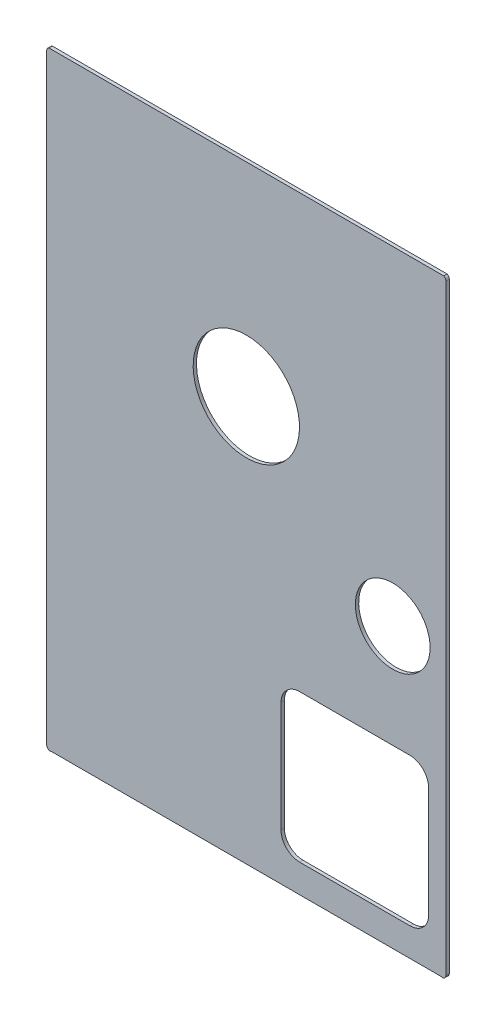
ISO-10303-21;
HEADER;
FILE_DESCRIPTION(('STEP AP214'),'2;1');
FILE_NAME('part.step','',(''),(''),'','','');
FILE_SCHEMA(('AUTOMOTIVE_DESIGN { 1 0 10303 214 1 1 1 1 }'));
ENDSEC;
DATA;
#1=APPLICATION_CONTEXT('core data for automotive mechanical design processes');
#2=APPLICATION_PROTOCOL_DEFINITION('international standard','automotive_design',2000,#1);
#3=PRODUCT_CONTEXT('',#1,'mechanical');
#4=PRODUCT('Part','Part','',(#3));
#5=PRODUCT_RELATED_PRODUCT_CATEGORY('part','',(#4));
#6=PRODUCT_DEFINITION_FORMATION('','',#4);
#7=PRODUCT_DEFINITION_CONTEXT('part definition',#1,'design');
#8=PRODUCT_DEFINITION('design','',#6,#7);
#9=PRODUCT_DEFINITION_SHAPE('','',#8);
#10=(LENGTH_UNIT() NAMED_UNIT(*) SI_UNIT(.MILLI.,.METRE.));
#11=(NAMED_UNIT(*) PLANE_ANGLE_UNIT() SI_UNIT($,.RADIAN.));
#12=(NAMED_UNIT(*) SI_UNIT($,.STERADIAN.) SOLID_ANGLE_UNIT());
#13=UNCERTAINTY_MEASURE_WITH_UNIT(LENGTH_MEASURE(1.E-05),#10,'distance_accuracy_value','');
#14=(GEOMETRIC_REPRESENTATION_CONTEXT(3) GLOBAL_UNCERTAINTY_ASSIGNED_CONTEXT((#13)) GLOBAL_UNIT_ASSIGNED_CONTEXT((#10,
#11,#12)) REPRESENTATION_CONTEXT('',''));
#15=CARTESIAN_POINT('',(0.,0.,0.));
#16=DIRECTION('',(0.,0.,1.));
#17=DIRECTION('',(1.,0.,0.));
#18=AXIS2_PLACEMENT_3D('',#15,#16,#17);
#19=CARTESIAN_POINT('',(0.,7.35,0.));
#20=DIRECTION('',(0.,-1.,0.));
#21=DIRECTION('',(0.,0.,-1.));
#22=AXIS2_PLACEMENT_3D('',#19,#20,#21);
#23=PLANE('',#22);
#24=DIRECTION('',(1.,0.,0.));
#25=VECTOR('',#24,1.);
#26=CARTESIAN_POINT('',(0.,7.35,0.));
#27=LINE('',#26,#25);
#28=CARTESIAN_POINT('',(8.5,7.35,0.));
#29=VERTEX_POINT('',#28);
#30=CARTESIAN_POINT('',(8.4000009125,7.35,0.));
#31=VERTEX_POINT('',#30);
#32=EDGE_CURVE('E175',#29,#31,#27,.F.);
#33=ORIENTED_EDGE('',*,*,#32,.F.);
#34=DIRECTION('',(0.,0.,-1.));
#35=VECTOR('',#34,1.);
#36=CARTESIAN_POINT('',(8.5,7.35,0.));
#37=LINE('',#36,#35);
#38=CARTESIAN_POINT('',(8.5,7.35,1.786));
#39=VERTEX_POINT('',#38);
#40=EDGE_CURVE('E178',#29,#39,#37,.F.);
#41=ORIENTED_EDGE('',*,*,#40,.T.);
#42=DIRECTION('',(1.,0.,0.));
#43=VECTOR('',#42,1.);
#44=CARTESIAN_POINT('',(0.,7.35,1.786));
#45=LINE('',#44,#43);
#46=CARTESIAN_POINT('',(8.4000009125,7.35,1.786));
#47=VERTEX_POINT('',#46);
#48=EDGE_CURVE('E161',#47,#39,#45,.T.);
#49=ORIENTED_EDGE('',*,*,#48,.F.);
#50=DIRECTION('',(0.,0.,-1.));
#51=VECTOR('',#50,1.);
#52=CARTESIAN_POINT('',(8.4,7.35,0.893));
#53=LINE('',#52,#51);
#54=EDGE_CURVE('E286',#47,#31,#53,.T.);
#55=ORIENTED_EDGE('',*,*,#54,.T.);
#56=EDGE_LOOP('',(#33,#41,#49,#55));
#57=FACE_BOUND('',#56,.T.);
#58=ADVANCED_FACE('F17',(#57),#23,.T.);
#59=CARTESIAN_POINT('',(217.8,0.,0.));
#60=DIRECTION('',(-1.,0.,0.));
#61=DIRECTION('',(0.,0.,1.));
#62=AXIS2_PLACEMENT_3D('',#59,#60,#61);
#63=PLANE('',#62);
#64=DIRECTION('',(0.,1.,0.));
#65=VECTOR('',#64,1.);
#66=CARTESIAN_POINT('',(217.8,0.,0.));
#67=LINE('',#66,#65);
#68=CARTESIAN_POINT('',(217.8,7.35,0.));
#69=VERTEX_POINT('',#68);
#70=CARTESIAN_POINT('',(217.8,7.55,0.));
#71=VERTEX_POINT('',#70);
#72=EDGE_CURVE('E186',#69,#71,#67,.T.);
#73=ORIENTED_EDGE('',*,*,#72,.F.);
#74=DIRECTION('',(0.,0.,-1.));
#75=VECTOR('',#74,1.);
#76=CARTESIAN_POINT('',(217.8,7.35,0.));
#77=LINE('',#76,#75);
#78=CARTESIAN_POINT('',(217.8,7.35,1.786));
#79=VERTEX_POINT('',#78);
#80=EDGE_CURVE('E283',#69,#79,#77,.F.);
#81=ORIENTED_EDGE('',*,*,#80,.T.);
#82=DIRECTION('',(0.,1.,0.));
#83=VECTOR('',#82,1.);
#84=CARTESIAN_POINT('',(217.8,0.,1.786));
#85=LINE('',#84,#83);
#86=CARTESIAN_POINT('',(217.8,7.55,1.786));
#87=VERTEX_POINT('',#86);
#88=EDGE_CURVE('E189',#87,#79,#85,.F.);
#89=ORIENTED_EDGE('',*,*,#88,.F.);
#90=DIRECTION('',(0.,0.,-1.));
#91=VECTOR('',#90,1.);
#92=CARTESIAN_POINT('',(217.8,7.55,0.));
#93=LINE('',#92,#91);
#94=EDGE_CURVE('E274',#87,#71,#93,.T.);
#95=ORIENTED_EDGE('',*,*,#94,.T.);
#96=EDGE_LOOP('',(#73,#81,#89,#95));
#97=FACE_BOUND('',#96,.T.);
#98=ADVANCED_FACE('F584',(#97),#63,.T.);
#99=CARTESIAN_POINT('',(8.5,0.,0.));
#100=DIRECTION('',(1.,0.,0.));
#101=DIRECTION('',(0.,0.,-1.));
#102=AXIS2_PLACEMENT_3D('',#99,#100,#101);
#103=PLANE('',#102);
#104=DIRECTION('',(0.,1.,0.));
#105=VECTOR('',#104,1.);
#106=CARTESIAN_POINT('',(8.5,0.,0.));
#107=LINE('',#106,#105);
#108=CARTESIAN_POINT('',(8.5,7.55,0.));
#109=VERTEX_POINT('',#108);
#110=EDGE_CURVE('E155',#109,#29,#107,.F.);
#111=ORIENTED_EDGE('',*,*,#110,.F.);
#112=DIRECTION('',(0.,0.,-1.));
#113=VECTOR('',#112,1.);
#114=CARTESIAN_POINT('',(8.5,7.55,0.));
#115=LINE('',#114,#113);
#116=CARTESIAN_POINT('',(8.5,7.55,1.786));
#117=VERTEX_POINT('',#116);
#118=EDGE_CURVE('E184',#109,#117,#115,.F.);
#119=ORIENTED_EDGE('',*,*,#118,.T.);
#120=DIRECTION('',(0.,1.,0.));
#121=VECTOR('',#120,1.);
#122=CARTESIAN_POINT('',(8.5,0.,1.786));
#123=LINE('',#122,#121);
#124=EDGE_CURVE('E167',#39,#117,#123,.T.);
#125=ORIENTED_EDGE('',*,*,#124,.F.);
#126=ORIENTED_EDGE('',*,*,#40,.F.);
#127=EDGE_LOOP('',(#111,#119,#125,#126));
#128=FACE_BOUND('',#127,.T.);
#129=ADVANCED_FACE('F182',(#128),#103,.T.);
#130=CARTESIAN_POINT('',(0.,7.35,0.));
#131=DIRECTION('',(0.,-1.,0.));
#132=DIRECTION('',(0.,0.,-1.));
#133=AXIS2_PLACEMENT_3D('',#130,#131,#132);
#134=PLANE('',#133);
#135=DIRECTION('',(1.,0.,0.));
#136=VECTOR('',#135,1.);
#137=CARTESIAN_POINT('',(0.,7.35,0.));
#138=LINE('',#137,#136);
#139=CARTESIAN_POINT('',(217.8999991,7.35,0.));
#140=VERTEX_POINT('',#139);
#141=EDGE_CURVE('E143',#140,#69,#138,.F.);
#142=ORIENTED_EDGE('',*,*,#141,.F.);
#143=DIRECTION('',(0.,0.,1.));
#144=VECTOR('',#143,1.);
#145=CARTESIAN_POINT('',(217.9,7.35,0.893));
#146=LINE('',#145,#144);
#147=CARTESIAN_POINT('',(217.8999991,7.35,1.786));
#148=VERTEX_POINT('',#147);
#149=EDGE_CURVE('E304',#140,#148,#146,.T.);
#150=ORIENTED_EDGE('',*,*,#149,.T.);
#151=DIRECTION('',(1.,0.,0.));
#152=VECTOR('',#151,1.);
#153=CARTESIAN_POINT('',(0.,7.35,1.786));
#154=LINE('',#153,#152);
#155=EDGE_CURVE('E180',#79,#148,#154,.T.);
#156=ORIENTED_EDGE('',*,*,#155,.F.);
#157=ORIENTED_EDGE('',*,*,#80,.F.);
#158=EDGE_LOOP('',(#142,#150,#156,#157));
#159=FACE_BOUND('',#158,.T.);
#160=ADVANCED_FACE('F567',(#159),#134,.T.);
#161=CARTESIAN_POINT('',(6.3,0.,0.));
#162=DIRECTION('',(-1.,0.,0.));
#163=DIRECTION('',(0.,0.,1.));
#164=AXIS2_PLACEMENT_3D('',#161,#162,#163);
#165=PLANE('',#164);
#166=DIRECTION('',(0.,1.,0.));
#167=VECTOR('',#166,1.);
#168=CARTESIAN_POINT('',(6.3,0.,0.));
#169=LINE('',#168,#167);
#170=CARTESIAN_POINT('',(6.30000001132748,331.0499991,0.));
#171=VERTEX_POINT('',#170);
#172=CARTESIAN_POINT('',(6.3,9.4500009125,0.));
#173=VERTEX_POINT('',#172);
#174=EDGE_CURVE('E226',#171,#173,#169,.F.);
#175=ORIENTED_EDGE('',*,*,#174,.T.);
#176=DIRECTION('',(0.,0.,1.));
#177=VECTOR('',#176,1.);
#178=CARTESIAN_POINT('',(6.3,9.45,0.893));
#179=LINE('',#178,#177);
#180=CARTESIAN_POINT('',(6.3,9.4500009125,1.786));
#181=VERTEX_POINT('',#180);
#182=EDGE_CURVE('E277',#173,#181,#179,.T.);
#183=ORIENTED_EDGE('',*,*,#182,.T.);
#184=DIRECTION('',(0.,1.,0.));
#185=VECTOR('',#184,1.);
#186=CARTESIAN_POINT('',(6.3,0.,1.786));
#187=LINE('',#186,#185);
#188=CARTESIAN_POINT('',(6.30000001132748,331.0499991,1.786));
#189=VERTEX_POINT('',#188);
#190=EDGE_CURVE('E254',#181,#189,#187,.T.);
#191=ORIENTED_EDGE('',*,*,#190,.T.);
#192=DIRECTION('',(0.,0.,-1.));
#193=VECTOR('',#192,1.);
#194=CARTESIAN_POINT('',(6.30000002265496,331.05,0.893));
#195=LINE('',#194,#193);
#196=EDGE_CURVE('E230',#189,#171,#195,.T.);
#197=ORIENTED_EDGE('',*,*,#196,.T.);
#198=EDGE_LOOP('',(#175,#183,#191,#197));
#199=FACE_BOUND('',#198,.T.);
#200=ADVANCED_FACE('F559',(#199),#165,.T.);
#201=CARTESIAN_POINT('',(8.400001825,9.450001825,0.));
#202=DIRECTION('',(0.,0.,1.));
#203=DIRECTION('',(1.,0.,0.));
#204=AXIS2_PLACEMENT_3D('',#201,#202,#203);
#205=CYLINDRICAL_SURFACE('',#204,2.10000182500079);
#206=CARTESIAN_POINT('',(8.400001825,9.450001825,0.));
#207=DIRECTION('',(0.,0.,1.));
#208=DIRECTION('',(1.,0.,0.));
#209=AXIS2_PLACEMENT_3D('',#206,#207,#208);
#210=CIRCLE('',#209,2.10000182500079);
#211=EDGE_CURVE('E223',#173,#31,#210,.T.);
#212=ORIENTED_EDGE('',*,*,#211,.T.);
#213=ORIENTED_EDGE('',*,*,#54,.F.);
#214=CARTESIAN_POINT('',(8.400001825,9.450001825,1.786));
#215=DIRECTION('',(0.,0.,1.));
#216=DIRECTION('',(1.,0.,0.));
#217=AXIS2_PLACEMENT_3D('',#214,#215,#216);
#218=CIRCLE('',#217,2.10000182500079);
#219=EDGE_CURVE('E171',#47,#181,#218,.F.);
#220=ORIENTED_EDGE('',*,*,#219,.T.);
#221=ORIENTED_EDGE('',*,*,#182,.F.);
#222=EDGE_LOOP('',(#212,#213,#220,#221));
#223=FACE_BOUND('',#222,.T.);
#224=ADVANCED_FACE('F551',(#223),#205,.T.);
#225=CARTESIAN_POINT('',(0.,7.55,0.));
#226=DIRECTION('',(0.,-1.,0.));
#227=DIRECTION('',(0.,0.,-1.));
#228=AXIS2_PLACEMENT_3D('',#225,#226,#227);
#229=PLANE('',#228);
#230=DIRECTION('',(1.,0.,0.));
#231=VECTOR('',#230,1.);
#232=CARTESIAN_POINT('',(0.,7.55,0.));
#233=LINE('',#232,#231);
#234=EDGE_CURVE('E222',#109,#71,#233,.T.);
#235=ORIENTED_EDGE('',*,*,#234,.T.);
#236=ORIENTED_EDGE('',*,*,#94,.F.);
#237=DIRECTION('',(1.,0.,0.));
#238=VECTOR('',#237,1.);
#239=CARTESIAN_POINT('',(0.,7.55,1.786));
#240=LINE('',#239,#238);
#241=EDGE_CURVE('E255',#87,#117,#240,.F.);
#242=ORIENTED_EDGE('',*,*,#241,.T.);
#243=ORIENTED_EDGE('',*,*,#118,.F.);
#244=EDGE_LOOP('',(#235,#236,#242,#243));
#245=FACE_BOUND('',#244,.T.);
#246=ADVANCED_FACE('F543',(#245),#229,.T.);
#247=CARTESIAN_POINT('',(217.8999982,9.450001825,0.));
#248=DIRECTION('',(0.,0.,1.));
#249=DIRECTION('',(1.,0.,0.));
#250=AXIS2_PLACEMENT_3D('',#247,#248,#249);
#251=CYLINDRICAL_SURFACE('',#250,2.10000182500077);
#252=CARTESIAN_POINT('',(217.8999982,9.450001825,0.));
#253=DIRECTION('',(0.,0.,1.));
#254=DIRECTION('',(1.,0.,0.));
#255=AXIS2_PLACEMENT_3D('',#252,#253,#254);
#256=CIRCLE('',#255,2.10000182500077);
#257=CARTESIAN_POINT('',(220.,9.4500009125,0.));
#258=VERTEX_POINT('',#257);
#259=EDGE_CURVE('E220',#140,#258,#256,.T.);
#260=ORIENTED_EDGE('',*,*,#259,.T.);
#261=DIRECTION('',(0.,0.,-1.));
#262=VECTOR('',#261,1.);
#263=CARTESIAN_POINT('',(220.,9.45,0.));
#264=LINE('',#263,#262);
#265=CARTESIAN_POINT('',(220.,9.4500009125,1.786));
#266=VERTEX_POINT('',#265);
#267=EDGE_CURVE('E134',#258,#266,#264,.F.);
#268=ORIENTED_EDGE('',*,*,#267,.T.);
#269=CARTESIAN_POINT('',(217.8999982,9.450001825,1.786));
#270=DIRECTION('',(0.,0.,1.));
#271=DIRECTION('',(1.,0.,0.));
#272=AXIS2_PLACEMENT_3D('',#269,#270,#271);
#273=CIRCLE('',#272,2.10000182500077);
#274=EDGE_CURVE('E20',#266,#148,#273,.F.);
#275=ORIENTED_EDGE('',*,*,#274,.T.);
#276=ORIENTED_EDGE('',*,*,#149,.F.);
#277=EDGE_LOOP('',(#260,#268,#275,#276));
#278=FACE_BOUND('',#277,.T.);
#279=ADVANCED_FACE('F535',(#278),#251,.T.);
#280=CARTESIAN_POINT('',(200.7,91.7,1.786));
#281=DIRECTION('',(0.,0.,-1.));
#282=DIRECTION('',(-1.,0.,0.));
#283=AXIS2_PLACEMENT_3D('',#280,#281,#282);
#284=CYLINDRICAL_SURFACE('',#283,9.99999999999999);
#285=CARTESIAN_POINT('',(200.7,91.7,0.));
#286=DIRECTION('',(0.,0.,-1.));
#287=DIRECTION('',(-1.,0.,0.));
#288=AXIS2_PLACEMENT_3D('',#285,#286,#287);
#289=CIRCLE('',#288,9.99999999999999);
#290=CARTESIAN_POINT('',(200.7,101.7,0.));
#291=VERTEX_POINT('',#290);
#292=CARTESIAN_POINT('',(210.7,91.7,0.));
#293=VERTEX_POINT('',#292);
#294=EDGE_CURVE('E217',#291,#293,#289,.T.);
#295=ORIENTED_EDGE('',*,*,#294,.T.);
#296=DIRECTION('',(0.,0.,1.));
#297=VECTOR('',#296,1.);
#298=CARTESIAN_POINT('',(210.7,91.7,0.));
#299=LINE('',#298,#297);
#300=CARTESIAN_POINT('',(210.7,91.7,1.786));
#301=VERTEX_POINT('',#300);
#302=EDGE_CURVE('E307',#293,#301,#299,.T.);
#303=ORIENTED_EDGE('',*,*,#302,.T.);
#304=CARTESIAN_POINT('',(200.7,91.7,1.786));
#305=DIRECTION('',(0.,0.,-1.));
#306=DIRECTION('',(-1.,0.,0.));
#307=AXIS2_PLACEMENT_3D('',#304,#305,#306);
#308=CIRCLE('',#307,9.99999999999999);
#309=CARTESIAN_POINT('',(200.7,101.7,1.786));
#310=VERTEX_POINT('',#309);
#311=EDGE_CURVE('E239',#301,#310,#308,.F.);
#312=ORIENTED_EDGE('',*,*,#311,.T.);
#313=DIRECTION('',(0.,0.,1.));
#314=VECTOR('',#313,1.);
#315=CARTESIAN_POINT('',(200.7,101.7,0.));
#316=LINE('',#315,#314);
#317=EDGE_CURVE('E309',#310,#291,#316,.F.);
#318=ORIENTED_EDGE('',*,*,#317,.T.);
#319=EDGE_LOOP('',(#295,#303,#312,#318));
#320=FACE_BOUND('',#319,.T.);
#321=ADVANCED_FACE('F358',(#320),#284,.F.);
#322=CARTESIAN_POINT('',(210.7,0.,0.));
#323=DIRECTION('',(-1.,0.,0.));
#324=DIRECTION('',(0.,0.,1.));
#325=AXIS2_PLACEMENT_3D('',#322,#323,#324);
#326=PLANE('',#325);
#327=DIRECTION('',(0.,0.,-1.));
#328=VECTOR('',#327,1.);
#329=CARTESIAN_POINT('',(210.7,32.7,0.893));
#330=LINE('',#329,#328);
#331=CARTESIAN_POINT('',(210.7,32.7,0.));
#332=VERTEX_POINT('',#331);
#333=CARTESIAN_POINT('',(210.7,32.7,1.786));
#334=VERTEX_POINT('',#333);
#335=EDGE_CURVE('E311',#332,#334,#330,.F.);
#336=ORIENTED_EDGE('',*,*,#335,.T.);
#337=DIRECTION('',(0.,1.,0.));
#338=VECTOR('',#337,1.);
#339=CARTESIAN_POINT('',(210.7,0.,1.786));
#340=LINE('',#339,#338);
#341=EDGE_CURVE('E242',#334,#301,#340,.T.);
#342=ORIENTED_EDGE('',*,*,#341,.T.);
#343=ORIENTED_EDGE('',*,*,#302,.F.);
#344=DIRECTION('',(0.,1.,0.));
#345=VECTOR('',#344,1.);
#346=CARTESIAN_POINT('',(210.7,0.,0.));
#347=LINE('',#346,#345);
#348=EDGE_CURVE('E216',#293,#332,#347,.F.);
#349=ORIENTED_EDGE('',*,*,#348,.T.);
#350=EDGE_LOOP('',(#336,#342,#343,#349));
#351=FACE_BOUND('',#350,.T.);
#352=ADVANCED_FACE('F360',(#351),#326,.T.);
#353=CARTESIAN_POINT('',(200.7,32.7,1.786));
#354=DIRECTION('',(0.,0.,-1.));
#355=DIRECTION('',(0.,1.,0.));
#356=AXIS2_PLACEMENT_3D('',#353,#354,#355);
#357=CYLINDRICAL_SURFACE('',#356,10.);
#358=CARTESIAN_POINT('',(200.7,32.7,0.));
#359=DIRECTION('',(0.,0.,-1.));
#360=DIRECTION('',(0.,1.,0.));
#361=AXIS2_PLACEMENT_3D('',#358,#359,#360);
#362=CIRCLE('',#361,10.);
#363=CARTESIAN_POINT('',(200.7,22.7,0.));
#364=VERTEX_POINT('',#363);
#365=EDGE_CURVE('E214',#332,#364,#362,.T.);
#366=ORIENTED_EDGE('',*,*,#365,.T.);
#367=DIRECTION('',(0.,0.,-1.));
#368=VECTOR('',#367,1.);
#369=CARTESIAN_POINT('',(200.7,22.7,0.));
#370=LINE('',#369,#368);
#371=CARTESIAN_POINT('',(200.7,22.7,1.786));
#372=VERTEX_POINT('',#371);
#373=EDGE_CURVE('E313',#364,#372,#370,.F.);
#374=ORIENTED_EDGE('',*,*,#373,.T.);
#375=CARTESIAN_POINT('',(200.7,32.7,1.786));
#376=DIRECTION('',(0.,0.,-1.));
#377=DIRECTION('',(0.,1.,0.));
#378=AXIS2_PLACEMENT_3D('',#375,#376,#377);
#379=CIRCLE('',#378,10.);
#380=EDGE_CURVE('E243',#372,#334,#379,.F.);
#381=ORIENTED_EDGE('',*,*,#380,.T.);
#382=ORIENTED_EDGE('',*,*,#335,.F.);
#383=EDGE_LOOP('',(#366,#374,#381,#382));
#384=FACE_BOUND('',#383,.T.);
#385=ADVANCED_FACE('F387',(#384),#357,.F.);
#386=CARTESIAN_POINT('',(0.,22.7,0.));
#387=DIRECTION('',(0.,-1.,0.));
#388=DIRECTION('',(0.,0.,-1.));
#389=AXIS2_PLACEMENT_3D('',#386,#387,#388);
#390=PLANE('',#389);
#391=DIRECTION('',(1.,0.,0.));
#392=VECTOR('',#391,1.);
#393=CARTESIAN_POINT('',(0.,22.7,0.));
#394=LINE('',#393,#392);
#395=CARTESIAN_POINT('',(141.7,22.7,0.));
#396=VERTEX_POINT('',#395);
#397=EDGE_CURVE('E213',#364,#396,#394,.F.);
#398=ORIENTED_EDGE('',*,*,#397,.T.);
#399=DIRECTION('',(0.,0.,-1.));
#400=VECTOR('',#399,1.);
#401=CARTESIAN_POINT('',(141.7,22.7,0.893));
#402=LINE('',#401,#400);
#403=CARTESIAN_POINT('',(141.7,22.7,1.786));
#404=VERTEX_POINT('',#403);
#405=EDGE_CURVE('E315',#396,#404,#402,.F.);
#406=ORIENTED_EDGE('',*,*,#405,.T.);
#407=DIRECTION('',(1.,0.,0.));
#408=VECTOR('',#407,1.);
#409=CARTESIAN_POINT('',(0.,22.7,1.786));
#410=LINE('',#409,#408);
#411=EDGE_CURVE('E246',#404,#372,#410,.T.);
#412=ORIENTED_EDGE('',*,*,#411,.T.);
#413=ORIENTED_EDGE('',*,*,#373,.F.);
#414=EDGE_LOOP('',(#398,#406,#412,#413));
#415=FACE_BOUND('',#414,.T.);
#416=ADVANCED_FACE('F384',(#415),#390,.F.);
#417=CARTESIAN_POINT('',(141.7,32.7,1.786));
#418=DIRECTION('',(0.,0.,-1.));
#419=DIRECTION('',(-1.,0.,0.));
#420=AXIS2_PLACEMENT_3D('',#417,#418,#419);
#421=CYLINDRICAL_SURFACE('',#420,10.);
#422=CARTESIAN_POINT('',(141.7,32.7,0.));
#423=DIRECTION('',(0.,0.,-1.));
#424=DIRECTION('',(-1.,0.,0.));
#425=AXIS2_PLACEMENT_3D('',#422,#423,#424);
#426=CIRCLE('',#425,10.);
#427=CARTESIAN_POINT('',(131.7,32.7,0.));
#428=VERTEX_POINT('',#427);
#429=EDGE_CURVE('E211',#396,#428,#426,.T.);
#430=ORIENTED_EDGE('',*,*,#429,.T.);
#431=DIRECTION('',(0.,0.,-1.));
#432=VECTOR('',#431,1.);
#433=CARTESIAN_POINT('',(131.7,32.7,0.));
#434=LINE('',#433,#432);
#435=CARTESIAN_POINT('',(131.7,32.7,1.786));
#436=VERTEX_POINT('',#435);
#437=EDGE_CURVE('E317',#428,#436,#434,.F.);
#438=ORIENTED_EDGE('',*,*,#437,.T.);
#439=CARTESIAN_POINT('',(141.7,32.7,1.786));
#440=DIRECTION('',(0.,0.,-1.));
#441=DIRECTION('',(-1.,0.,0.));
#442=AXIS2_PLACEMENT_3D('',#439,#440,#441);
#443=CIRCLE('',#442,10.);
#444=EDGE_CURVE('E247',#436,#404,#443,.F.);
#445=ORIENTED_EDGE('',*,*,#444,.T.);
#446=ORIENTED_EDGE('',*,*,#405,.F.);
#447=EDGE_LOOP('',(#430,#438,#445,#446));
#448=FACE_BOUND('',#447,.T.);
#449=ADVANCED_FACE('F380',(#448),#421,.F.);
#450=CARTESIAN_POINT('',(131.7,0.,0.));
#451=DIRECTION('',(1.,0.,0.));
#452=DIRECTION('',(0.,0.,-1.));
#453=AXIS2_PLACEMENT_3D('',#450,#451,#452);
#454=PLANE('',#453);
#455=DIRECTION('',(0.,0.,-1.));
#456=VECTOR('',#455,1.);
#457=CARTESIAN_POINT('',(131.7,91.7,0.893));
#458=LINE('',#457,#456);
#459=CARTESIAN_POINT('',(131.7,91.7,0.));
#460=VERTEX_POINT('',#459);
#461=CARTESIAN_POINT('',(131.7,91.7,1.786));
#462=VERTEX_POINT('',#461);
#463=EDGE_CURVE('E319',#460,#462,#458,.F.);
#464=ORIENTED_EDGE('',*,*,#463,.T.);
#465=DIRECTION('',(0.,1.,0.));
#466=VECTOR('',#465,1.);
#467=CARTESIAN_POINT('',(131.7,0.,1.786));
#468=LINE('',#467,#466);
#469=EDGE_CURVE('E250',#462,#436,#468,.F.);
#470=ORIENTED_EDGE('',*,*,#469,.T.);
#471=ORIENTED_EDGE('',*,*,#437,.F.);
#472=DIRECTION('',(0.,1.,0.));
#473=VECTOR('',#472,1.);
#474=CARTESIAN_POINT('',(131.7,0.,0.));
#475=LINE('',#474,#473);
#476=EDGE_CURVE('E210',#428,#460,#475,.T.);
#477=ORIENTED_EDGE('',*,*,#476,.T.);
#478=EDGE_LOOP('',(#464,#470,#471,#477));
#479=FACE_BOUND('',#478,.T.);
#480=ADVANCED_FACE('F378',(#479),#454,.T.);
#481=CARTESIAN_POINT('',(141.7,91.7,1.786));
#482=DIRECTION('',(0.,0.,-1.));
#483=DIRECTION('',(0.,1.,0.));
#484=AXIS2_PLACEMENT_3D('',#481,#482,#483);
#485=CYLINDRICAL_SURFACE('',#484,10.);
#486=CARTESIAN_POINT('',(141.7,91.7,0.));
#487=DIRECTION('',(0.,0.,-1.));
#488=DIRECTION('',(0.,1.,0.));
#489=AXIS2_PLACEMENT_3D('',#486,#487,#488);
#490=CIRCLE('',#489,10.);
#491=CARTESIAN_POINT('',(141.7,101.7,0.));
#492=VERTEX_POINT('',#491);
#493=EDGE_CURVE('E208',#460,#492,#490,.T.);
#494=ORIENTED_EDGE('',*,*,#493,.T.);
#495=DIRECTION('',(0.,0.,1.));
#496=VECTOR('',#495,1.);
#497=CARTESIAN_POINT('',(141.7,101.7,0.));
#498=LINE('',#497,#496);
#499=CARTESIAN_POINT('',(141.7,101.7,1.786));
#500=VERTEX_POINT('',#499);
#501=EDGE_CURVE('E321',#492,#500,#498,.T.);
#502=ORIENTED_EDGE('',*,*,#501,.T.);
#503=CARTESIAN_POINT('',(141.7,91.7,1.786));
#504=DIRECTION('',(0.,0.,-1.));
#505=DIRECTION('',(0.,1.,0.));
#506=AXIS2_PLACEMENT_3D('',#503,#504,#505);
#507=CIRCLE('',#506,10.);
#508=EDGE_CURVE('E251',#500,#462,#507,.F.);
#509=ORIENTED_EDGE('',*,*,#508,.T.);
#510=ORIENTED_EDGE('',*,*,#463,.F.);
#511=EDGE_LOOP('',(#494,#502,#509,#510));
#512=FACE_BOUND('',#511,.T.);
#513=ADVANCED_FACE('F372',(#512),#485,.F.);
#514=CARTESIAN_POINT('',(0.,101.7,0.));
#515=DIRECTION('',(0.,1.,0.));
#516=DIRECTION('',(0.,0.,1.));
#517=AXIS2_PLACEMENT_3D('',#514,#515,#516);
#518=PLANE('',#517);
#519=DIRECTION('',(1.,0.,0.));
#520=VECTOR('',#519,1.);
#521=CARTESIAN_POINT('',(0.,101.7,1.786));
#522=LINE('',#521,#520);
#523=EDGE_CURVE('E253',#310,#500,#522,.F.);
#524=ORIENTED_EDGE('',*,*,#523,.T.);
#525=ORIENTED_EDGE('',*,*,#501,.F.);
#526=DIRECTION('',(1.,0.,0.));
#527=VECTOR('',#526,1.);
#528=CARTESIAN_POINT('',(0.,101.7,0.));
#529=LINE('',#528,#527);
#530=EDGE_CURVE('E207',#492,#291,#529,.T.);
#531=ORIENTED_EDGE('',*,*,#530,.T.);
#532=ORIENTED_EDGE('',*,*,#317,.F.);
#533=EDGE_LOOP('',(#524,#525,#531,#532));
#534=FACE_BOUND('',#533,.T.);
#535=ADVANCED_FACE('F350',(#534),#518,.F.);
#536=CARTESIAN_POINT('',(191.5,157.,1.786));
#537=DIRECTION('',(0.,0.,-1.));
#538=DIRECTION('',(0.,1.,0.));
#539=AXIS2_PLACEMENT_3D('',#536,#537,#538);
#540=CYLINDRICAL_SURFACE('',#539,19.9999999802044);
#541=CARTESIAN_POINT('',(191.5,157.,0.));
#542=DIRECTION('',(0.,0.,-1.));
#543=DIRECTION('',(0.,1.,0.));
#544=AXIS2_PLACEMENT_3D('',#541,#542,#543);
#545=CIRCLE('',#544,19.9999999802044);
#546=CARTESIAN_POINT('',(191.5,176.999999980204,0.));
#547=VERTEX_POINT('',#546);
#548=EDGE_CURVE('E204',#547,#547,#545,.T.);
#549=ORIENTED_EDGE('',*,*,#548,.T.);
#550=EDGE_LOOP('',(#549));
#551=FACE_BOUND('',#550,.T.);
#552=CARTESIAN_POINT('',(191.5,157.,1.786));
#553=DIRECTION('',(0.,0.,-1.));
#554=DIRECTION('',(0.,1.,0.));
#555=AXIS2_PLACEMENT_3D('',#552,#553,#554);
#556=CIRCLE('',#555,19.9999999802044);
#557=CARTESIAN_POINT('',(191.5,176.999999980204,1.786));
#558=VERTEX_POINT('',#557);
#559=EDGE_CURVE('E236',#558,#558,#556,.F.);
#560=ORIENTED_EDGE('',*,*,#559,.T.);
#561=EDGE_LOOP('',(#560));
#562=FACE_BOUND('',#561,.T.);
#563=ADVANCED_FACE('F425',(#551,#562),#540,.F.);
#564=CARTESIAN_POINT('',(113.145,224.253,1.786));
#565=DIRECTION('',(0.,0.,-1.));
#566=DIRECTION('',(0.,1.,0.));
#567=AXIS2_PLACEMENT_3D('',#564,#565,#566);
#568=CYLINDRICAL_SURFACE('',#567,28.4500000165081);
#569=CARTESIAN_POINT('',(113.145,224.253,0.));
#570=DIRECTION('',(0.,0.,-1.));
#571=DIRECTION('',(0.,1.,0.));
#572=AXIS2_PLACEMENT_3D('',#569,#570,#571);
#573=CIRCLE('',#572,28.4500000165081);
#574=CARTESIAN_POINT('',(113.145,252.703000016508,0.));
#575=VERTEX_POINT('',#574);
#576=EDGE_CURVE('E201',#575,#575,#573,.T.);
#577=ORIENTED_EDGE('',*,*,#576,.T.);
#578=EDGE_LOOP('',(#577));
#579=FACE_BOUND('',#578,.T.);
#580=CARTESIAN_POINT('',(113.145,224.253,1.786));
#581=DIRECTION('',(0.,0.,-1.));
#582=DIRECTION('',(0.,1.,0.));
#583=AXIS2_PLACEMENT_3D('',#580,#581,#582);
#584=CIRCLE('',#583,28.4500000252839);
#585=CARTESIAN_POINT('',(113.145,252.703000025284,1.786));
#586=VERTEX_POINT('',#585);
#587=EDGE_CURVE('E233',#586,#586,#584,.F.);
#588=ORIENTED_EDGE('',*,*,#587,.T.);
#589=EDGE_LOOP('',(#588));
#590=FACE_BOUND('',#589,.T.);
#591=ADVANCED_FACE('F421',(#579,#590),#568,.F.);
#592=CARTESIAN_POINT('',(220.,0.,0.));
#593=DIRECTION('',(1.,0.,0.));
#594=DIRECTION('',(0.,0.,-1.));
#595=AXIS2_PLACEMENT_3D('',#592,#593,#594);
#596=PLANE('',#595);
#597=DIRECTION('',(0.,1.,0.));
#598=VECTOR('',#597,1.);
#599=CARTESIAN_POINT('',(220.,0.,0.));
#600=LINE('',#599,#598);
#601=CARTESIAN_POINT('',(220.,331.0499991,0.));
#602=VERTEX_POINT('',#601);
#603=EDGE_CURVE('E219',#258,#602,#600,.T.);
#604=ORIENTED_EDGE('',*,*,#603,.T.);
#605=DIRECTION('',(0.,0.,1.));
#606=VECTOR('',#605,1.);
#607=CARTESIAN_POINT('',(220.,331.05,0.893));
#608=LINE('',#607,#606);
#609=CARTESIAN_POINT('',(220.,331.0499991,1.786));
#610=VERTEX_POINT('',#609);
#611=EDGE_CURVE('E198',#602,#610,#608,.T.);
#612=ORIENTED_EDGE('',*,*,#611,.T.);
#613=DIRECTION('',(0.,1.,0.));
#614=VECTOR('',#613,1.);
#615=CARTESIAN_POINT('',(220.,0.,1.786));
#616=LINE('',#615,#614);
#617=EDGE_CURVE('E262',#610,#266,#616,.F.);
#618=ORIENTED_EDGE('',*,*,#617,.T.);
#619=ORIENTED_EDGE('',*,*,#267,.F.);
#620=EDGE_LOOP('',(#604,#612,#618,#619));
#621=FACE_BOUND('',#620,.T.);
#622=ADVANCED_FACE('F417',(#621),#596,.T.);
#623=CARTESIAN_POINT('',(0.,0.,1.786));
#624=DIRECTION('',(0.,0.,1.));
#625=DIRECTION('',(1.,0.,0.));
#626=AXIS2_PLACEMENT_3D('',#623,#624,#625);
#627=PLANE('',#626);
#628=ORIENTED_EDGE('',*,*,#587,.F.);
#629=EDGE_LOOP('',(#628));
#630=FACE_BOUND('',#629,.T.);
#631=ORIENTED_EDGE('',*,*,#559,.F.);
#632=EDGE_LOOP('',(#631));
#633=FACE_BOUND('',#632,.T.);
#634=ORIENTED_EDGE('',*,*,#341,.F.);
#635=ORIENTED_EDGE('',*,*,#380,.F.);
#636=ORIENTED_EDGE('',*,*,#411,.F.);
#637=ORIENTED_EDGE('',*,*,#444,.F.);
#638=ORIENTED_EDGE('',*,*,#469,.F.);
#639=ORIENTED_EDGE('',*,*,#508,.F.);
#640=ORIENTED_EDGE('',*,*,#523,.F.);
#641=ORIENTED_EDGE('',*,*,#311,.F.);
#642=EDGE_LOOP('',(#634,#635,#636,#637,#638,#639,#640,#641));
#643=FACE_BOUND('',#642,.T.);
#644=CARTESIAN_POINT('',(8.400001825,331.0499982,1.786));
#645=DIRECTION('',(0.,0.,1.));
#646=DIRECTION('',(1.,0.,0.));
#647=AXIS2_PLACEMENT_3D('',#644,#645,#646);
#648=CIRCLE('',#647,2.10000180234587);
#649=CARTESIAN_POINT('',(7.505574226,332.95,1.786));
#650=VERTEX_POINT('',#649);
#651=EDGE_CURVE('E231',#650,#189,#648,.T.);
#652=ORIENTED_EDGE('',*,*,#651,.T.);
#653=ORIENTED_EDGE('',*,*,#190,.F.);
#654=ORIENTED_EDGE('',*,*,#219,.F.);
#655=ORIENTED_EDGE('',*,*,#48,.T.);
#656=ORIENTED_EDGE('',*,*,#124,.T.);
#657=ORIENTED_EDGE('',*,*,#241,.F.);
#658=ORIENTED_EDGE('',*,*,#88,.T.);
#659=ORIENTED_EDGE('',*,*,#155,.T.);
#660=ORIENTED_EDGE('',*,*,#274,.F.);
#661=ORIENTED_EDGE('',*,*,#617,.F.);
#662=CARTESIAN_POINT('',(217.8999982,331.0499982,1.786));
#663=DIRECTION('',(0.,0.,1.));
#664=DIRECTION('',(1.,0.,0.));
#665=AXIS2_PLACEMENT_3D('',#662,#663,#664);
#666=CIRCLE('',#665,2.10000180000077);
#667=CARTESIAN_POINT('',(218.794425796747,332.95,1.786));
#668=VERTEX_POINT('',#667);
#669=EDGE_CURVE('E199',#610,#668,#666,.T.);
#670=ORIENTED_EDGE('',*,*,#669,.T.);
#671=DIRECTION('',(1.,0.,0.));
#672=VECTOR('',#671,1.);
#673=CARTESIAN_POINT('',(0.,332.95,1.786));
#674=LINE('',#673,#672);
#675=EDGE_CURVE('E326',#668,#650,#674,.F.);
#676=ORIENTED_EDGE('',*,*,#675,.T.);
#677=EDGE_LOOP('',(#652,#653,#654,#655,#656,#657,#658,#659,#660,#661,#670,#676));
#678=FACE_BOUND('',#677,.T.);
#679=ADVANCED_FACE('F164',(#630,#633,#643,#678),#627,.T.);
#680=CARTESIAN_POINT('',(8.400001825,331.0499982,0.));
#681=DIRECTION('',(0.,0.,1.));
#682=DIRECTION('',(1.,0.,0.));
#683=AXIS2_PLACEMENT_3D('',#680,#681,#682);
#684=CYLINDRICAL_SURFACE('',#683,2.10000180234587);
#685=CARTESIAN_POINT('',(8.400001825,331.0499982,0.));
#686=DIRECTION('',(0.,0.,1.));
#687=DIRECTION('',(1.,0.,0.));
#688=AXIS2_PLACEMENT_3D('',#685,#686,#687);
#689=CIRCLE('',#688,2.10000180234587);
#690=CARTESIAN_POINT('',(7.505574226,332.95,0.));
#691=VERTEX_POINT('',#690);
#692=EDGE_CURVE('E227',#691,#171,#689,.T.);
#693=ORIENTED_EDGE('',*,*,#692,.T.);
#694=ORIENTED_EDGE('',*,*,#196,.F.);
#695=ORIENTED_EDGE('',*,*,#651,.F.);
#696=DIRECTION('',(0.,0.,1.));
#697=VECTOR('',#696,1.);
#698=CARTESIAN_POINT('',(7.505574226,332.95,0.));
#699=LINE('',#698,#697);
#700=EDGE_CURVE('E336',#650,#691,#699,.F.);
#701=ORIENTED_EDGE('',*,*,#700,.T.);
#702=EDGE_LOOP('',(#693,#694,#695,#701));
#703=FACE_BOUND('',#702,.T.);
#704=ADVANCED_FACE('F410',(#703),#684,.T.);
#705=CARTESIAN_POINT('',(0.,0.,0.));
#706=DIRECTION('',(0.,0.,1.));
#707=DIRECTION('',(1.,0.,0.));
#708=AXIS2_PLACEMENT_3D('',#705,#706,#707);
#709=PLANE('',#708);
#710=ORIENTED_EDGE('',*,*,#576,.F.);
#711=EDGE_LOOP('',(#710));
#712=FACE_BOUND('',#711,.T.);
#713=ORIENTED_EDGE('',*,*,#548,.F.);
#714=EDGE_LOOP('',(#713));
#715=FACE_BOUND('',#714,.T.);
#716=ORIENTED_EDGE('',*,*,#493,.F.);
#717=ORIENTED_EDGE('',*,*,#476,.F.);
#718=ORIENTED_EDGE('',*,*,#429,.F.);
#719=ORIENTED_EDGE('',*,*,#397,.F.);
#720=ORIENTED_EDGE('',*,*,#365,.F.);
#721=ORIENTED_EDGE('',*,*,#348,.F.);
#722=ORIENTED_EDGE('',*,*,#294,.F.);
#723=ORIENTED_EDGE('',*,*,#530,.F.);
#724=EDGE_LOOP('',(#716,#717,#718,#719,#720,#721,#722,#723));
#725=FACE_BOUND('',#724,.T.);
#726=ORIENTED_EDGE('',*,*,#603,.F.);
#727=ORIENTED_EDGE('',*,*,#259,.F.);
#728=ORIENTED_EDGE('',*,*,#141,.T.);
#729=ORIENTED_EDGE('',*,*,#72,.T.);
#730=ORIENTED_EDGE('',*,*,#234,.F.);
#731=ORIENTED_EDGE('',*,*,#110,.T.);
#732=ORIENTED_EDGE('',*,*,#32,.T.);
#733=ORIENTED_EDGE('',*,*,#211,.F.);
#734=ORIENTED_EDGE('',*,*,#174,.F.);
#735=ORIENTED_EDGE('',*,*,#692,.F.);
#736=DIRECTION('',(1.,0.,0.));
#737=VECTOR('',#736,1.);
#738=CARTESIAN_POINT('',(0.,332.95,0.));
#739=LINE('',#738,#737);
#740=CARTESIAN_POINT('',(218.794425796747,332.95,0.));
#741=VERTEX_POINT('',#740);
#742=EDGE_CURVE('E26',#691,#741,#739,.T.);
#743=ORIENTED_EDGE('',*,*,#742,.T.);
#744=CARTESIAN_POINT('',(217.8999982,331.0499982,0.));
#745=DIRECTION('',(0.,0.,1.));
#746=DIRECTION('',(1.,0.,0.));
#747=AXIS2_PLACEMENT_3D('',#744,#745,#746);
#748=CIRCLE('',#747,2.10000180000077);
#749=EDGE_CURVE('E196',#741,#602,#748,.F.);
#750=ORIENTED_EDGE('',*,*,#749,.T.);
#751=EDGE_LOOP('',(#726,#727,#728,#729,#730,#731,#732,#733,#734,#735,#743,#750));
#752=FACE_BOUND('',#751,.T.);
#753=ADVANCED_FACE('F354',(#712,#715,#725,#752),#709,.F.);
#754=CARTESIAN_POINT('',(217.8999982,331.0499982,0.));
#755=DIRECTION('',(0.,0.,1.));
#756=DIRECTION('',(1.,0.,0.));
#757=AXIS2_PLACEMENT_3D('',#754,#755,#756);
#758=CYLINDRICAL_SURFACE('',#757,2.10000180000077);
#759=ORIENTED_EDGE('',*,*,#749,.F.);
#760=DIRECTION('',(0.,0.,1.));
#761=VECTOR('',#760,1.);
#762=CARTESIAN_POINT('',(218.7944258,332.95,0.));
#763=LINE('',#762,#761);
#764=EDGE_CURVE('E11',#741,#668,#763,.T.);
#765=ORIENTED_EDGE('',*,*,#764,.T.);
#766=ORIENTED_EDGE('',*,*,#669,.F.);
#767=ORIENTED_EDGE('',*,*,#611,.F.);
#768=EDGE_LOOP('',(#759,#765,#766,#767));
#769=FACE_BOUND('',#768,.T.);
#770=ADVANCED_FACE('F399',(#769),#758,.T.);
#771=CARTESIAN_POINT('',(0.,332.95,0.));
#772=DIRECTION('',(0.,1.,0.));
#773=DIRECTION('',(0.,0.,1.));
#774=AXIS2_PLACEMENT_3D('',#771,#772,#773);
#775=PLANE('',#774);
#776=ORIENTED_EDGE('',*,*,#742,.F.);
#777=ORIENTED_EDGE('',*,*,#700,.F.);
#778=ORIENTED_EDGE('',*,*,#675,.F.);
#779=ORIENTED_EDGE('',*,*,#764,.F.);
#780=EDGE_LOOP('',(#776,#777,#778,#779));
#781=FACE_BOUND('',#780,.T.);
#782=ADVANCED_FACE('F397',(#781),#775,.T.);
#783=CLOSED_SHELL('',(#58,#98,#129,#160,#200,#224,#246,#279,#321,#352,#385,#416,#449,#480,#513,
#535,#563,#591,#622,#679,#704,#753,#770,#782));
#784=MANIFOLD_SOLID_BREP('B1',#783);
#785=ADVANCED_BREP_SHAPE_REPRESENTATION('',(#18,#784),#14);
#786=SHAPE_DEFINITION_REPRESENTATION(#9,#785);
ENDSEC;
END-ISO-10303-21;
